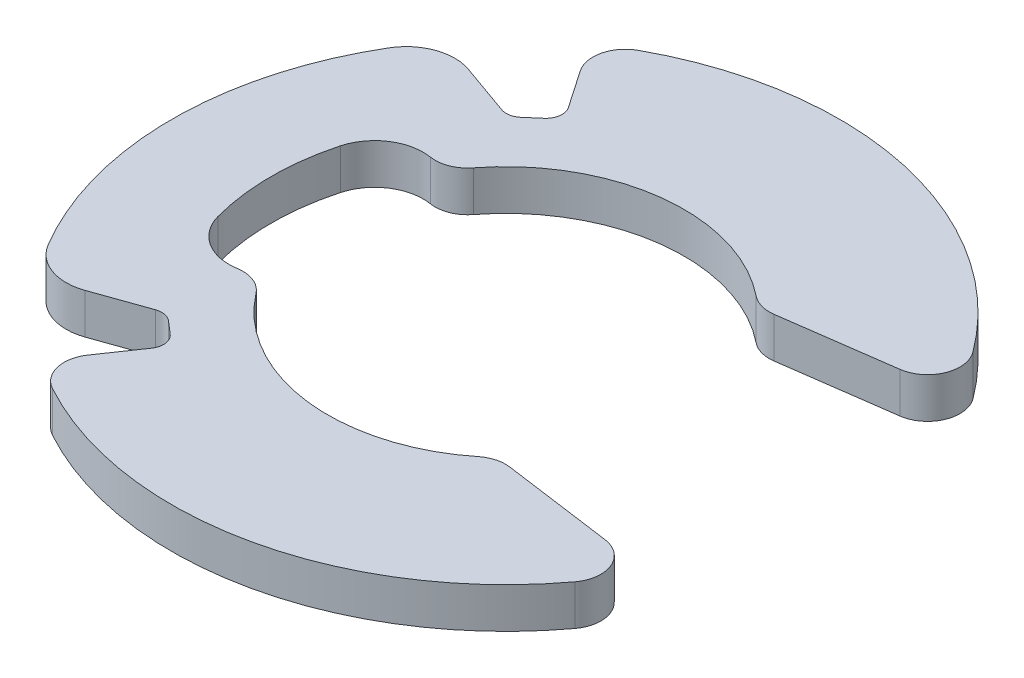
ISO-10303-21;
HEADER;
FILE_DESCRIPTION(('STEP AP214'),'2;1');
FILE_NAME('part.step','',(''),(''),'','','');
FILE_SCHEMA(('AUTOMOTIVE_DESIGN { 1 0 10303 214 1 1 1 1 }'));
ENDSEC;
DATA;
#1=APPLICATION_CONTEXT('core data for automotive mechanical design processes');
#2=APPLICATION_PROTOCOL_DEFINITION('international standard','automotive_design',2000,#1);
#3=PRODUCT_CONTEXT('',#1,'mechanical');
#4=PRODUCT('Part','Part','',(#3));
#5=PRODUCT_RELATED_PRODUCT_CATEGORY('part','',(#4));
#6=PRODUCT_DEFINITION_FORMATION('','',#4);
#7=PRODUCT_DEFINITION_CONTEXT('part definition',#1,'design');
#8=PRODUCT_DEFINITION('design','',#6,#7);
#9=PRODUCT_DEFINITION_SHAPE('','',#8);
#10=(LENGTH_UNIT() NAMED_UNIT(*) SI_UNIT(.MILLI.,.METRE.));
#11=(NAMED_UNIT(*) PLANE_ANGLE_UNIT() SI_UNIT($,.RADIAN.));
#12=(NAMED_UNIT(*) SI_UNIT($,.STERADIAN.) SOLID_ANGLE_UNIT());
#13=UNCERTAINTY_MEASURE_WITH_UNIT(LENGTH_MEASURE(1.E-05),#10,'distance_accuracy_value','');
#14=(GEOMETRIC_REPRESENTATION_CONTEXT(3) GLOBAL_UNCERTAINTY_ASSIGNED_CONTEXT((#13)) GLOBAL_UNIT_ASSIGNED_CONTEXT((#10,
#11,#12)) REPRESENTATION_CONTEXT('',''));
#15=CARTESIAN_POINT('',(0.,0.,0.));
#16=DIRECTION('',(0.,0.,1.));
#17=DIRECTION('',(1.,0.,0.));
#18=AXIS2_PLACEMENT_3D('',#15,#16,#17);
#19=CARTESIAN_POINT('',(1.14274908979972E-13,0.635,0.));
#20=DIRECTION('',(0.,-1.,0.));
#21=DIRECTION('',(0.,0.,-1.));
#22=AXIS2_PLACEMENT_3D('',#19,#20,#21);
#23=CYLINDRICAL_SURFACE('',#22,10.4775);
#24=CARTESIAN_POINT('',(1.14274908979972E-13,-0.635,0.));
#25=DIRECTION('',(0.,1.,0.));
#26=DIRECTION('',(0.,0.,1.));
#27=AXIS2_PLACEMENT_3D('',#24,#25,#26);
#28=CIRCLE('',#27,10.4775);
#29=CARTESIAN_POINT('',(-9.00694258292967,-0.635,-5.35284891976307));
#30=VERTEX_POINT('',#29);
#31=CARTESIAN_POINT('',(-9.00694258292967,-0.635,5.35284891976307));
#32=VERTEX_POINT('',#31);
#33=EDGE_CURVE('E179',#30,#32,#28,.T.);
#34=ORIENTED_EDGE('',*,*,#33,.T.);
#35=DIRECTION('',(0.,-1.,0.));
#36=VECTOR('',#35,1.);
#37=CARTESIAN_POINT('',(-9.00694258292967,0.635,5.35284891976307));
#38=LINE('',#37,#36);
#39=CARTESIAN_POINT('',(-9.00694258292967,0.635,5.35284891976307));
#40=VERTEX_POINT('',#39);
#41=EDGE_CURVE('E302',#40,#32,#38,.T.);
#42=ORIENTED_EDGE('',*,*,#41,.F.);
#43=CARTESIAN_POINT('',(1.14274908979972E-13,0.635,0.));
#44=DIRECTION('',(0.,1.,0.));
#45=DIRECTION('',(0.,0.,1.));
#46=AXIS2_PLACEMENT_3D('',#43,#44,#45);
#47=CIRCLE('',#46,10.4775);
#48=CARTESIAN_POINT('',(-9.00694258292967,0.635,-5.35284891976307));
#49=VERTEX_POINT('',#48);
#50=EDGE_CURVE('E210',#49,#40,#47,.T.);
#51=ORIENTED_EDGE('',*,*,#50,.F.);
#52=DIRECTION('',(0.,-1.,0.));
#53=VECTOR('',#52,1.);
#54=CARTESIAN_POINT('',(-9.00694258292967,0.635,-5.35284891976307));
#55=LINE('',#54,#53);
#56=EDGE_CURVE('E175',#49,#30,#55,.T.);
#57=ORIENTED_EDGE('',*,*,#56,.T.);
#58=EDGE_LOOP('',(#34,#42,#51,#57));
#59=FACE_BOUND('',#58,.T.);
#60=ADVANCED_FACE('F36',(#59),#23,.T.);
#61=CARTESIAN_POINT('',(0.,0.635,0.));
#62=DIRECTION('',(0.,-1.,0.));
#63=DIRECTION('',(0.,0.,-1.));
#64=AXIS2_PLACEMENT_3D('',#61,#62,#63);
#65=CYLINDRICAL_SURFACE('',#64,7.366);
#66=CARTESIAN_POINT('',(0.,-0.635,0.));
#67=DIRECTION('',(0.,-1.,0.));
#68=DIRECTION('',(0.,0.,1.));
#69=AXIS2_PLACEMENT_3D('',#66,#67,#68);
#70=CIRCLE('',#69,7.366);
#71=CARTESIAN_POINT('',(-7.11094530391807,-0.635,1.92156521739066));
#72=VERTEX_POINT('',#71);
#73=CARTESIAN_POINT('',(-7.11094530391807,-0.635,-1.92156521739066));
#74=VERTEX_POINT('',#73);
#75=EDGE_CURVE('E182',#72,#74,#70,.T.);
#76=ORIENTED_EDGE('',*,*,#75,.T.);
#77=DIRECTION('',(0.,-1.,0.));
#78=VECTOR('',#77,1.);
#79=CARTESIAN_POINT('',(-7.11094530391807,0.635,-1.92156521739066));
#80=LINE('',#79,#78);
#81=CARTESIAN_POINT('',(-7.11094530391807,0.635,-1.92156521739066));
#82=VERTEX_POINT('',#81);
#83=EDGE_CURVE('E11',#82,#74,#80,.T.);
#84=ORIENTED_EDGE('',*,*,#83,.F.);
#85=CARTESIAN_POINT('',(0.,0.635,0.));
#86=DIRECTION('',(0.,-1.,0.));
#87=DIRECTION('',(0.,0.,1.));
#88=AXIS2_PLACEMENT_3D('',#85,#86,#87);
#89=CIRCLE('',#88,7.366);
#90=CARTESIAN_POINT('',(-7.11094530391807,0.635,1.92156521739066));
#91=VERTEX_POINT('',#90);
#92=EDGE_CURVE('E117',#91,#82,#89,.T.);
#93=ORIENTED_EDGE('',*,*,#92,.F.);
#94=DIRECTION('',(0.,-1.,0.));
#95=VECTOR('',#94,1.);
#96=CARTESIAN_POINT('',(-7.11094530391807,0.635,1.92156521739066));
#97=LINE('',#96,#95);
#98=EDGE_CURVE('E183',#91,#72,#97,.T.);
#99=ORIENTED_EDGE('',*,*,#98,.T.);
#100=EDGE_LOOP('',(#76,#84,#93,#99));
#101=FACE_BOUND('',#100,.T.);
#102=ADVANCED_FACE('F523',(#101),#65,.F.);
#103=CARTESIAN_POINT('',(-5.63971524103831,0.635,-1.52399999999945));
#104=DIRECTION('',(0.,-1.,0.));
#105=DIRECTION('',(0.,0.,-1.));
#106=AXIS2_PLACEMENT_3D('',#103,#104,#105);
#107=CYLINDRICAL_SURFACE('',#106,1.52400000000016);
#108=CARTESIAN_POINT('',(-5.63971524103831,-0.635,-1.52399999999945));
#109=DIRECTION('',(0.,-1.,0.));
#110=DIRECTION('',(0.,0.,1.));
#111=AXIS2_PLACEMENT_3D('',#108,#109,#110);
#112=CIRCLE('',#111,1.52400000000016);
#113=CARTESIAN_POINT('',(-5.39455199334738,-0.635,-3.02815124970213));
#114=VERTEX_POINT('',#113);
#115=EDGE_CURVE('E185',#74,#114,#112,.T.);
#116=ORIENTED_EDGE('',*,*,#115,.T.);
#117=DIRECTION('',(0.,-1.,0.));
#118=VECTOR('',#117,1.);
#119=CARTESIAN_POINT('',(-5.39455199334738,0.635,-3.02815124970213));
#120=LINE('',#119,#118);
#121=CARTESIAN_POINT('',(-5.39455199334738,0.635,-3.02815124970213));
#122=VERTEX_POINT('',#121);
#123=EDGE_CURVE('E44',#122,#114,#120,.T.);
#124=ORIENTED_EDGE('',*,*,#123,.F.);
#125=CARTESIAN_POINT('',(-5.63971524103831,0.635,-1.52399999999945));
#126=DIRECTION('',(0.,-1.,0.));
#127=DIRECTION('',(0.,0.,1.));
#128=AXIS2_PLACEMENT_3D('',#125,#126,#127);
#129=CIRCLE('',#128,1.52400000000016);
#130=EDGE_CURVE('E520',#82,#122,#129,.T.);
#131=ORIENTED_EDGE('',*,*,#130,.F.);
#132=ORIENTED_EDGE('',*,*,#83,.T.);
#133=EDGE_LOOP('',(#116,#124,#131,#132));
#134=FACE_BOUND('',#133,.T.);
#135=ADVANCED_FACE('F521',(#134),#107,.F.);
#136=CARTESIAN_POINT('',(-5.23110982821991,0.635,-4.03091874950377));
#137=DIRECTION('',(0.,-1.,0.));
#138=DIRECTION('',(0.,0.,-1.));
#139=AXIS2_PLACEMENT_3D('',#136,#137,#138);
#140=CYLINDRICAL_SURFACE('',#139,1.016);
#141=CARTESIAN_POINT('',(-5.23110982821991,-0.635,-4.03091874950377));
#142=DIRECTION('',(0.,1.,0.));
#143=DIRECTION('',(0.,0.,1.));
#144=AXIS2_PLACEMENT_3D('',#141,#142,#143);
#145=CIRCLE('',#144,1.016);
#146=CARTESIAN_POINT('',(-4.4263237008015,-0.635,-3.41077740342622));
#147=VERTEX_POINT('',#146);
#148=EDGE_CURVE('E187',#114,#147,#145,.T.);
#149=ORIENTED_EDGE('',*,*,#148,.T.);
#150=DIRECTION('',(0.,-1.,0.));
#151=VECTOR('',#150,1.);
#152=CARTESIAN_POINT('',(-4.4263237008015,0.635,-3.41077740342622));
#153=LINE('',#152,#151);
#154=CARTESIAN_POINT('',(-4.4263237008015,0.635,-3.41077740342622));
#155=VERTEX_POINT('',#154);
#156=EDGE_CURVE('E238',#155,#147,#153,.T.);
#157=ORIENTED_EDGE('',*,*,#156,.F.);
#158=CARTESIAN_POINT('',(-5.23110982821991,0.635,-4.03091874950377));
#159=DIRECTION('',(0.,1.,0.));
#160=DIRECTION('',(0.,0.,1.));
#161=AXIS2_PLACEMENT_3D('',#158,#159,#160);
#162=CIRCLE('',#161,1.016);
#163=EDGE_CURVE('E247',#122,#155,#162,.T.);
#164=ORIENTED_EDGE('',*,*,#163,.F.);
#165=ORIENTED_EDGE('',*,*,#123,.T.);
#166=EDGE_LOOP('',(#149,#157,#164,#165));
#167=FACE_BOUND('',#166,.T.);
#168=ADVANCED_FACE('F245',(#167),#140,.T.);
#169=CARTESIAN_POINT('',(0.,0.635,0.));
#170=DIRECTION('',(0.,-1.,0.));
#171=DIRECTION('',(0.,0.,-1.));
#172=AXIS2_PLACEMENT_3D('',#169,#170,#171);
#173=CYLINDRICAL_SURFACE('',#172,5.588);
#174=CARTESIAN_POINT('',(0.,-0.635,0.));
#175=DIRECTION('',(0.,-1.,0.));
#176=DIRECTION('',(0.,0.,1.));
#177=AXIS2_PLACEMENT_3D('',#174,#175,#176);
#178=CIRCLE('',#177,5.588);
#179=CARTESIAN_POINT('',(3.49456367614932,-0.635,-4.36047803724978));
#180=VERTEX_POINT('',#179);
#181=EDGE_CURVE('E189',#147,#180,#178,.T.);
#182=ORIENTED_EDGE('',*,*,#181,.T.);
#183=DIRECTION('',(0.,-1.,0.));
#184=VECTOR('',#183,1.);
#185=CARTESIAN_POINT('',(3.49456367614932,0.635,-4.36047803724978));
#186=LINE('',#185,#184);
#187=CARTESIAN_POINT('',(3.49456367614932,0.635,-4.36047803724978));
#188=VERTEX_POINT('',#187);
#189=EDGE_CURVE('E235',#188,#180,#186,.T.);
#190=ORIENTED_EDGE('',*,*,#189,.F.);
#191=CARTESIAN_POINT('',(0.,0.635,0.));
#192=DIRECTION('',(0.,-1.,0.));
#193=DIRECTION('',(0.,0.,1.));
#194=AXIS2_PLACEMENT_3D('',#191,#192,#193);
#195=CIRCLE('',#194,5.588);
#196=EDGE_CURVE('E269',#155,#188,#195,.T.);
#197=ORIENTED_EDGE('',*,*,#196,.F.);
#198=ORIENTED_EDGE('',*,*,#156,.T.);
#199=EDGE_LOOP('',(#182,#190,#197,#198));
#200=FACE_BOUND('',#199,.T.);
#201=ADVANCED_FACE('F260',(#200),#173,.F.);
#202=CARTESIAN_POINT('',(4.12993888999465,0.635,-5.15329222584065));
#203=DIRECTION('',(0.,-1.,0.));
#204=DIRECTION('',(0.,0.,-1.));
#205=AXIS2_PLACEMENT_3D('',#202,#203,#204);
#206=CYLINDRICAL_SURFACE('',#205,1.016);
#207=CARTESIAN_POINT('',(4.12993888999465,-0.635,-5.15329222584065));
#208=DIRECTION('',(0.,1.,0.));
#209=DIRECTION('',(0.,0.,1.));
#210=AXIS2_PLACEMENT_3D('',#207,#208,#209);
#211=CIRCLE('',#210,1.016);
#212=CARTESIAN_POINT('',(4.26923125519139,-0.635,-4.14688592766983));
#213=VERTEX_POINT('',#212);
#214=EDGE_CURVE('E191',#180,#213,#211,.T.);
#215=ORIENTED_EDGE('',*,*,#214,.T.);
#216=DIRECTION('',(0.,-1.,0.));
#217=VECTOR('',#216,1.);
#218=CARTESIAN_POINT('',(4.26923125519139,0.635,-4.14688592766983));
#219=LINE('',#218,#217);
#220=CARTESIAN_POINT('',(4.26923125519139,0.635,-4.14688592766983));
#221=VERTEX_POINT('',#220);
#222=EDGE_CURVE('E232',#221,#213,#219,.T.);
#223=ORIENTED_EDGE('',*,*,#222,.F.);
#224=CARTESIAN_POINT('',(4.12993888999465,0.635,-5.15329222584065));
#225=DIRECTION('',(0.,1.,0.));
#226=DIRECTION('',(0.,0.,1.));
#227=AXIS2_PLACEMENT_3D('',#224,#225,#226);
#228=CIRCLE('',#227,1.016);
#229=EDGE_CURVE('E266',#188,#221,#228,.T.);
#230=ORIENTED_EDGE('',*,*,#229,.F.);
#231=ORIENTED_EDGE('',*,*,#189,.T.);
#232=EDGE_LOOP('',(#215,#223,#230,#231));
#233=FACE_BOUND('',#232,.T.);
#234=ADVANCED_FACE('F264',(#233),#206,.T.);
#235=CARTESIAN_POINT('',(4.26923125519139,0.635,-4.14688592766983));
#236=DIRECTION('',(-0.137098784642455,0.,-0.990557380089393));
#237=DIRECTION('',(-0.990557380089393,0.,0.137098784642455));
#238=AXIS2_PLACEMENT_3D('',#235,#236,#237);
#239=PLANE('',#238);
#240=DIRECTION('',(0.990557380089393,0.,-0.137098784642455));
#241=VECTOR('',#240,1.);
#242=CARTESIAN_POINT('',(4.26923125519139,-0.635,-4.14688592766983));
#243=LINE('',#242,#241);
#244=CARTESIAN_POINT('',(7.74065797441335,-0.635,-4.62735116244273));
#245=VERTEX_POINT('',#244);
#246=EDGE_CURVE('E193',#213,#245,#243,.T.);
#247=ORIENTED_EDGE('',*,*,#246,.T.);
#248=DIRECTION('',(0.,-1.,0.));
#249=VECTOR('',#248,1.);
#250=CARTESIAN_POINT('',(7.74065797441335,0.635,-4.62735116244273));
#251=LINE('',#250,#249);
#252=CARTESIAN_POINT('',(7.74065797441335,0.635,-4.62735116244273));
#253=VERTEX_POINT('',#252);
#254=EDGE_CURVE('E229',#253,#245,#251,.T.);
#255=ORIENTED_EDGE('',*,*,#254,.F.);
#256=DIRECTION('',(0.990557380089393,0.,-0.137098784642455));
#257=VECTOR('',#256,1.);
#258=CARTESIAN_POINT('',(4.26923125519139,0.635,-4.14688592766983));
#259=LINE('',#258,#257);
#260=EDGE_CURVE('E268',#221,#253,#259,.T.);
#261=ORIENTED_EDGE('',*,*,#260,.F.);
#262=ORIENTED_EDGE('',*,*,#222,.T.);
#263=EDGE_LOOP('',(#247,#255,#261,#262));
#264=FACE_BOUND('',#263,.T.);
#265=ADVANCED_FACE('F578',(#264),#239,.F.);
#266=CARTESIAN_POINT('',(7.60136560921662,0.635,-5.63375746061355));
#267=DIRECTION('',(0.,-1.,0.));
#268=DIRECTION('',(0.,0.,-1.));
#269=AXIS2_PLACEMENT_3D('',#266,#267,#268);
#270=CYLINDRICAL_SURFACE('',#269,1.01599999999999);
#271=CARTESIAN_POINT('',(7.60136560921662,-0.635,-5.63375746061355));
#272=DIRECTION('',(0.,1.,0.));
#273=DIRECTION('',(0.,0.,1.));
#274=AXIS2_PLACEMENT_3D('',#271,#272,#273);
#275=CIRCLE('',#274,1.01599999999999);
#276=CARTESIAN_POINT('',(8.41761963436739,-0.635,-6.23872470470629));
#277=VERTEX_POINT('',#276);
#278=EDGE_CURVE('E195',#245,#277,#275,.T.);
#279=ORIENTED_EDGE('',*,*,#278,.T.);
#280=DIRECTION('',(0.,-1.,0.));
#281=VECTOR('',#280,1.);
#282=CARTESIAN_POINT('',(8.41761963436739,0.635,-6.23872470470629));
#283=LINE('',#282,#281);
#284=CARTESIAN_POINT('',(8.41761963436739,0.635,-6.23872470470629));
#285=VERTEX_POINT('',#284);
#286=EDGE_CURVE('E226',#285,#277,#283,.T.);
#287=ORIENTED_EDGE('',*,*,#286,.F.);
#288=CARTESIAN_POINT('',(7.60136560921662,0.635,-5.63375746061355));
#289=DIRECTION('',(0.,1.,0.));
#290=DIRECTION('',(0.,0.,1.));
#291=AXIS2_PLACEMENT_3D('',#288,#289,#290);
#292=CIRCLE('',#291,1.01599999999999);
#293=EDGE_CURVE('E271',#253,#285,#292,.T.);
#294=ORIENTED_EDGE('',*,*,#293,.F.);
#295=ORIENTED_EDGE('',*,*,#254,.T.);
#296=EDGE_LOOP('',(#279,#287,#294,#295));
#297=FACE_BOUND('',#296,.T.);
#298=ADVANCED_FACE('F581',(#297),#270,.T.);
#299=CARTESIAN_POINT('',(0.,0.635,0.));
#300=DIRECTION('',(0.,-1.,0.));
#301=DIRECTION('',(0.,0.,-1.));
#302=AXIS2_PLACEMENT_3D('',#299,#300,#301);
#303=CYLINDRICAL_SURFACE('',#302,10.4775);
#304=CARTESIAN_POINT('',(0.,-0.635,0.));
#305=DIRECTION('',(0.,1.,0.));
#306=DIRECTION('',(0.,0.,1.));
#307=AXIS2_PLACEMENT_3D('',#304,#305,#306);
#308=CIRCLE('',#307,10.4775);
#309=CARTESIAN_POINT('',(-5.03567484923132,-0.635,-9.18803488580768));
#310=VERTEX_POINT('',#309);
#311=EDGE_CURVE('E197',#277,#310,#308,.T.);
#312=ORIENTED_EDGE('',*,*,#311,.T.);
#313=DIRECTION('',(0.,-1.,0.));
#314=VECTOR('',#313,1.);
#315=CARTESIAN_POINT('',(-5.03567484923132,0.635,-9.18803488580768));
#316=LINE('',#315,#314);
#317=CARTESIAN_POINT('',(-5.03567484923132,0.635,-9.18803488580768));
#318=VERTEX_POINT('',#317);
#319=EDGE_CURVE('E223',#318,#310,#316,.T.);
#320=ORIENTED_EDGE('',*,*,#319,.F.);
#321=CARTESIAN_POINT('',(0.,0.635,0.));
#322=DIRECTION('',(0.,1.,0.));
#323=DIRECTION('',(0.,0.,1.));
#324=AXIS2_PLACEMENT_3D('',#321,#322,#323);
#325=CIRCLE('',#324,10.4775);
#326=EDGE_CURVE('E277',#285,#318,#325,.T.);
#327=ORIENTED_EDGE('',*,*,#326,.F.);
#328=ORIENTED_EDGE('',*,*,#286,.T.);
#329=EDGE_LOOP('',(#312,#320,#327,#328));
#330=FACE_BOUND('',#329,.T.);
#331=ADVANCED_FACE('F585',(#330),#303,.T.);
#332=CARTESIAN_POINT('',(-4.54736698506342,0.635,-8.29707392718391));
#333=DIRECTION('',(0.,-1.,0.));
#334=DIRECTION('',(0.,0.,-1.));
#335=AXIS2_PLACEMENT_3D('',#332,#333,#334);
#336=CYLINDRICAL_SURFACE('',#335,1.016);
#337=CARTESIAN_POINT('',(-4.54736698506342,-0.635,-8.29707392718391));
#338=DIRECTION('',(0.,1.,0.));
#339=DIRECTION('',(0.,0.,1.));
#340=AXIS2_PLACEMENT_3D('',#337,#338,#339);
#341=CIRCLE('',#340,1.016);
#342=CARTESIAN_POINT('',(-5.38578246957464,-0.635,-7.7232137740701));
#343=VERTEX_POINT('',#342);
#344=EDGE_CURVE('E199',#310,#343,#341,.T.);
#345=ORIENTED_EDGE('',*,*,#344,.T.);
#346=DIRECTION('',(0.,-1.,0.));
#347=VECTOR('',#346,1.);
#348=CARTESIAN_POINT('',(-5.38578246957464,0.635,-7.7232137740701));
#349=LINE('',#348,#347);
#350=CARTESIAN_POINT('',(-5.38578246957464,0.635,-7.7232137740701));
#351=VERTEX_POINT('',#350);
#352=EDGE_CURVE('E220',#351,#343,#349,.T.);
#353=ORIENTED_EDGE('',*,*,#352,.F.);
#354=CARTESIAN_POINT('',(-4.54736698506342,0.635,-8.29707392718391));
#355=DIRECTION('',(0.,1.,0.));
#356=DIRECTION('',(0.,0.,1.));
#357=AXIS2_PLACEMENT_3D('',#354,#355,#356);
#358=CIRCLE('',#357,1.016);
#359=EDGE_CURVE('E279',#318,#351,#358,.T.);
#360=ORIENTED_EDGE('',*,*,#359,.F.);
#361=ORIENTED_EDGE('',*,*,#319,.T.);
#362=EDGE_LOOP('',(#345,#353,#360,#361));
#363=FACE_BOUND('',#362,.T.);
#364=ADVANCED_FACE('F589',(#363),#336,.T.);
#365=CARTESIAN_POINT('',(-5.38578246957464,0.635,-7.7232137740701));
#366=DIRECTION('',(0.825212091054353,0.,-0.564822985348243));
#367=DIRECTION('',(-0.564822985348243,0.,-0.825212091054353));
#368=AXIS2_PLACEMENT_3D('',#365,#366,#367);
#369=PLANE('',#368);
#370=DIRECTION('',(0.564822985348243,0.,0.825212091054353));
#371=VECTOR('',#370,1.);
#372=CARTESIAN_POINT('',(-5.38578246957464,-0.635,-7.7232137740701));
#373=LINE('',#372,#371);
#374=CARTESIAN_POINT('',(-4.57468029782294,-0.635,-6.53818530219007));
#375=VERTEX_POINT('',#374);
#376=EDGE_CURVE('E201',#343,#375,#373,.T.);
#377=ORIENTED_EDGE('',*,*,#376,.T.);
#378=DIRECTION('',(0.,-1.,0.));
#379=VECTOR('',#378,1.);
#380=CARTESIAN_POINT('',(-4.57468029782294,0.635,-6.53818530219007));
#381=LINE('',#380,#379);
#382=CARTESIAN_POINT('',(-4.57468029782294,0.635,-6.53818530219007));
#383=VERTEX_POINT('',#382);
#384=EDGE_CURVE('E217',#383,#375,#381,.T.);
#385=ORIENTED_EDGE('',*,*,#384,.F.);
#386=DIRECTION('',(0.564822985348243,0.,0.825212091054353));
#387=VECTOR('',#386,1.);
#388=CARTESIAN_POINT('',(-5.38578246957464,0.635,-7.7232137740701));
#389=LINE('',#388,#387);
#390=EDGE_CURVE('E281',#351,#383,#389,.T.);
#391=ORIENTED_EDGE('',*,*,#390,.F.);
#392=ORIENTED_EDGE('',*,*,#352,.T.);
#393=EDGE_LOOP('',(#377,#385,#391,#392));
#394=FACE_BOUND('',#393,.T.);
#395=ADVANCED_FACE('F593',(#394),#369,.F.);
#396=CARTESIAN_POINT('',(-4.99388804007852,0.635,-6.25125522563319));
#397=DIRECTION('',(0.,-1.,0.));
#398=DIRECTION('',(0.,0.,-1.));
#399=AXIS2_PLACEMENT_3D('',#396,#397,#398);
#400=CYLINDRICAL_SURFACE('',#399,0.507999999999915);
#401=CARTESIAN_POINT('',(-4.99388804007852,-0.635,-6.25125522563319));
#402=DIRECTION('',(0.,-1.,0.));
#403=DIRECTION('',(0.,0.,1.));
#404=AXIS2_PLACEMENT_3D('',#401,#402,#403);
#405=CIRCLE('',#404,0.507999999999915);
#406=CARTESIAN_POINT('',(-4.66221892309891,-0.635,-5.86647009488893));
#407=VERTEX_POINT('',#406);
#408=EDGE_CURVE('E203',#375,#407,#405,.T.);
#409=ORIENTED_EDGE('',*,*,#408,.T.);
#410=DIRECTION('',(0.,-1.,0.));
#411=VECTOR('',#410,1.);
#412=CARTESIAN_POINT('',(-4.66221892309891,0.635,-5.86647009488893));
#413=LINE('',#412,#411);
#414=CARTESIAN_POINT('',(-4.66221892309891,0.635,-5.86647009488893));
#415=VERTEX_POINT('',#414);
#416=EDGE_CURVE('E214',#415,#407,#413,.T.);
#417=ORIENTED_EDGE('',*,*,#416,.F.);
#418=CARTESIAN_POINT('',(-4.99388804007852,0.635,-6.25125522563319));
#419=DIRECTION('',(0.,-1.,0.));
#420=DIRECTION('',(0.,0.,1.));
#421=AXIS2_PLACEMENT_3D('',#418,#419,#420);
#422=CIRCLE('',#421,0.507999999999915);
#423=EDGE_CURVE('E283',#383,#415,#422,.T.);
#424=ORIENTED_EDGE('',*,*,#423,.F.);
#425=ORIENTED_EDGE('',*,*,#384,.T.);
#426=EDGE_LOOP('',(#409,#417,#424,#425));
#427=FACE_BOUND('',#426,.T.);
#428=ADVANCED_FACE('F289',(#427),#400,.F.);
#429=CARTESIAN_POINT('',(-4.66221892309894,0.635,-5.86647009488896));
#430=DIRECTION('',(0.652891962558231,0.,0.75745104477244));
#431=DIRECTION('',(0.75745104477244,0.,-0.652891962558231));
#432=AXIS2_PLACEMENT_3D('',#429,#430,#431);
#433=PLANE('',#432);
#434=DIRECTION('',(-0.75745104477244,0.,0.652891962558231));
#435=VECTOR('',#434,1.);
#436=CARTESIAN_POINT('',(-4.66221892309894,-0.635,-5.86647009488896));
#437=LINE('',#436,#435);
#438=CARTESIAN_POINT('',(-5.05650674369664,-0.635,-5.52661004613798));
#439=VERTEX_POINT('',#438);
#440=EDGE_CURVE('E205',#407,#439,#437,.T.);
#441=ORIENTED_EDGE('',*,*,#440,.T.);
#442=DIRECTION('',(0.,-1.,0.));
#443=VECTOR('',#442,1.);
#444=CARTESIAN_POINT('',(-5.05650674369664,0.635,-5.52661004613798));
#445=LINE('',#444,#443);
#446=CARTESIAN_POINT('',(-5.05650674369664,0.635,-5.52661004613798));
#447=VERTEX_POINT('',#446);
#448=EDGE_CURVE('E170',#447,#439,#445,.T.);
#449=ORIENTED_EDGE('',*,*,#448,.F.);
#450=DIRECTION('',(-0.75745104477244,0.,0.652891962558231));
#451=VECTOR('',#450,1.);
#452=CARTESIAN_POINT('',(-4.66221892309894,0.635,-5.86647009488896));
#453=LINE('',#452,#451);
#454=EDGE_CURVE('E161',#415,#447,#453,.T.);
#455=ORIENTED_EDGE('',*,*,#454,.F.);
#456=ORIENTED_EDGE('',*,*,#416,.T.);
#457=EDGE_LOOP('',(#441,#449,#455,#456));
#458=FACE_BOUND('',#457,.T.);
#459=ADVANCED_FACE('F293',(#458),#433,.F.);
#460=CARTESIAN_POINT('',(-5.38817586067612,0.635,-5.91139517688227));
#461=DIRECTION('',(0.,-1.,0.));
#462=DIRECTION('',(0.,0.,-1.));
#463=AXIS2_PLACEMENT_3D('',#460,#461,#462);
#464=CYLINDRICAL_SURFACE('',#463,0.507999999999914);
#465=CARTESIAN_POINT('',(-5.38817586067612,-0.635,-5.91139517688227));
#466=DIRECTION('',(0.,-1.,0.));
#467=DIRECTION('',(0.,0.,1.));
#468=AXIS2_PLACEMENT_3D('',#465,#466,#467);
#469=CIRCLE('',#468,0.507999999999914);
#470=CARTESIAN_POINT('',(-5.5580004534037,-0.635,-5.43262215372325));
#471=VERTEX_POINT('',#470);
#472=EDGE_CURVE('E169',#439,#471,#469,.T.);
#473=ORIENTED_EDGE('',*,*,#472,.T.);
#474=DIRECTION('',(0.,-1.,0.));
#475=VECTOR('',#474,1.);
#476=CARTESIAN_POINT('',(-5.5580004534037,0.635,-5.43262215372325));
#477=LINE('',#476,#475);
#478=CARTESIAN_POINT('',(-5.5580004534037,0.635,-5.43262215372325));
#479=VERTEX_POINT('',#478);
#480=EDGE_CURVE('E166',#479,#471,#477,.T.);
#481=ORIENTED_EDGE('',*,*,#480,.F.);
#482=CARTESIAN_POINT('',(-5.38817586067612,0.635,-5.91139517688227));
#483=DIRECTION('',(0.,-1.,0.));
#484=DIRECTION('',(0.,0.,1.));
#485=AXIS2_PLACEMENT_3D('',#482,#483,#484);
#486=CIRCLE('',#485,0.507999999999914);
#487=EDGE_CURVE('E155',#447,#479,#486,.T.);
#488=ORIENTED_EDGE('',*,*,#487,.F.);
#489=ORIENTED_EDGE('',*,*,#448,.T.);
#490=EDGE_LOOP('',(#473,#481,#488,#489));
#491=FACE_BOUND('',#490,.T.);
#492=ADVANCED_FACE('F167',(#491),#464,.F.);
#493=CARTESIAN_POINT('',(-5.55800045340372,0.635,-5.4326221537232));
#494=DIRECTION('',(-0.334300379385367,0.,0.942466581021735));
#495=DIRECTION('',(0.942466581021736,0.,0.334300379385367));
#496=AXIS2_PLACEMENT_3D('',#493,#494,#495);
#497=PLANE('',#496);
#498=DIRECTION('',(-0.942466581021736,0.,-0.334300379385367));
#499=VECTOR('',#498,1.);
#500=CARTESIAN_POINT('',(-5.55800045340372,-0.635,-5.4326221537232));
#501=LINE('',#500,#499);
#502=CARTESIAN_POINT('',(-7.18736806541079,-0.635,-6.01057178272934));
#503=VERTEX_POINT('',#502);
#504=EDGE_CURVE('E103',#471,#503,#501,.T.);
#505=ORIENTED_EDGE('',*,*,#504,.T.);
#506=DIRECTION('',(0.,-1.,0.));
#507=VECTOR('',#506,1.);
#508=CARTESIAN_POINT('',(-7.18736806541079,0.635,-6.01057178272934));
#509=LINE('',#508,#507);
#510=CARTESIAN_POINT('',(-7.18736806541079,0.635,-6.01057178272934));
#511=VERTEX_POINT('',#510);
#512=EDGE_CURVE('E171',#511,#503,#509,.T.);
#513=ORIENTED_EDGE('',*,*,#512,.F.);
#514=DIRECTION('',(-0.942466581021736,0.,-0.334300379385367));
#515=VECTOR('',#514,1.);
#516=CARTESIAN_POINT('',(-5.55800045340372,0.635,-5.4326221537232));
#517=LINE('',#516,#515);
#518=EDGE_CURVE('E159',#479,#511,#517,.T.);
#519=ORIENTED_EDGE('',*,*,#518,.F.);
#520=ORIENTED_EDGE('',*,*,#480,.T.);
#521=EDGE_LOOP('',(#505,#513,#519,#520));
#522=FACE_BOUND('',#521,.T.);
#523=ADVANCED_FACE('F173',(#522),#497,.F.);
#524=CARTESIAN_POINT('',(-7.69684184359433,0.635,-4.57425271325206));
#525=DIRECTION('',(0.,-1.,0.));
#526=DIRECTION('',(0.,0.,-1.));
#527=AXIS2_PLACEMENT_3D('',#524,#525,#526);
#528=CYLINDRICAL_SURFACE('',#527,1.52400000000011);
#529=CARTESIAN_POINT('',(-7.69684184359433,-0.635,-4.57425271325206));
#530=DIRECTION('',(0.,1.,0.));
#531=DIRECTION('',(0.,0.,1.));
#532=AXIS2_PLACEMENT_3D('',#529,#530,#531);
#533=CIRCLE('',#532,1.52400000000011);
#534=EDGE_CURVE('E109',#503,#30,#533,.T.);
#535=ORIENTED_EDGE('',*,*,#534,.T.);
#536=ORIENTED_EDGE('',*,*,#56,.F.);
#537=CARTESIAN_POINT('',(-7.69684184359433,0.635,-4.57425271325206));
#538=DIRECTION('',(0.,1.,0.));
#539=DIRECTION('',(0.,0.,1.));
#540=AXIS2_PLACEMENT_3D('',#537,#538,#539);
#541=CIRCLE('',#540,1.52400000000011);
#542=EDGE_CURVE('E52',#511,#49,#541,.T.);
#543=ORIENTED_EDGE('',*,*,#542,.F.);
#544=ORIENTED_EDGE('',*,*,#512,.T.);
#545=EDGE_LOOP('',(#535,#536,#543,#544));
#546=FACE_BOUND('',#545,.T.);
#547=ADVANCED_FACE('F606',(#546),#528,.T.);
#548=CARTESIAN_POINT('',(1.14274908979972E-13,0.635,0.));
#549=DIRECTION('',(0.,1.,0.));
#550=DIRECTION('',(0.,0.,1.));
#551=AXIS2_PLACEMENT_3D('',#548,#549,#550);
#552=PLANE('',#551);
#553=ORIENTED_EDGE('',*,*,#50,.T.);
#554=CARTESIAN_POINT('',(-7.69684184359433,0.635,4.57425271325206));
#555=DIRECTION('',(0.,-1.,0.));
#556=DIRECTION('',(0.,0.,-1.));
#557=AXIS2_PLACEMENT_3D('',#554,#555,#556);
#558=CIRCLE('',#557,1.52400000000011);
#559=CARTESIAN_POINT('',(-7.18736806541079,0.635,6.01057178272934));
#560=VERTEX_POINT('',#559);
#561=EDGE_CURVE('E446',#560,#40,#558,.T.);
#562=ORIENTED_EDGE('',*,*,#561,.F.);
#563=DIRECTION('',(-0.942466581021736,0.,0.334300379385367));
#564=VECTOR('',#563,1.);
#565=CARTESIAN_POINT('',(-5.55800045340372,0.635,5.4326221537232));
#566=LINE('',#565,#564);
#567=CARTESIAN_POINT('',(-5.5580004534037,0.635,5.43262215372325));
#568=VERTEX_POINT('',#567);
#569=EDGE_CURVE('E443',#568,#560,#566,.T.);
#570=ORIENTED_EDGE('',*,*,#569,.F.);
#571=CARTESIAN_POINT('',(-5.38817586067612,0.635,5.91139517688227));
#572=DIRECTION('',(0.,1.,0.));
#573=DIRECTION('',(0.,0.,-1.));
#574=AXIS2_PLACEMENT_3D('',#571,#572,#573);
#575=CIRCLE('',#574,0.507999999999914);
#576=CARTESIAN_POINT('',(-5.05650674369664,0.635,5.52661004613798));
#577=VERTEX_POINT('',#576);
#578=EDGE_CURVE('E440',#577,#568,#575,.T.);
#579=ORIENTED_EDGE('',*,*,#578,.F.);
#580=DIRECTION('',(-0.75745104477244,0.,-0.652891962558231));
#581=VECTOR('',#580,1.);
#582=CARTESIAN_POINT('',(-4.66221892309894,0.635,5.86647009488896));
#583=LINE('',#582,#581);
#584=CARTESIAN_POINT('',(-4.66221892309891,0.635,5.86647009488893));
#585=VERTEX_POINT('',#584);
#586=EDGE_CURVE('E437',#585,#577,#583,.T.);
#587=ORIENTED_EDGE('',*,*,#586,.F.);
#588=CARTESIAN_POINT('',(-4.99388804007852,0.635,6.25125522563319));
#589=DIRECTION('',(0.,1.,0.));
#590=DIRECTION('',(0.,0.,-1.));
#591=AXIS2_PLACEMENT_3D('',#588,#589,#590);
#592=CIRCLE('',#591,0.507999999999915);
#593=CARTESIAN_POINT('',(-4.57468029782294,0.635,6.53818530219007));
#594=VERTEX_POINT('',#593);
#595=EDGE_CURVE('E434',#594,#585,#592,.T.);
#596=ORIENTED_EDGE('',*,*,#595,.F.);
#597=DIRECTION('',(0.564822985348243,0.,-0.825212091054353));
#598=VECTOR('',#597,1.);
#599=CARTESIAN_POINT('',(-5.38578246957464,0.635,7.7232137740701));
#600=LINE('',#599,#598);
#601=CARTESIAN_POINT('',(-5.38578246957464,0.635,7.7232137740701));
#602=VERTEX_POINT('',#601);
#603=EDGE_CURVE('E431',#602,#594,#600,.T.);
#604=ORIENTED_EDGE('',*,*,#603,.F.);
#605=CARTESIAN_POINT('',(-4.54736698506342,0.635,8.29707392718391));
#606=DIRECTION('',(0.,-1.,0.));
#607=DIRECTION('',(0.,0.,-1.));
#608=AXIS2_PLACEMENT_3D('',#605,#606,#607);
#609=CIRCLE('',#608,1.016);
#610=CARTESIAN_POINT('',(-5.03567484923132,0.635,9.18803488580768));
#611=VERTEX_POINT('',#610);
#612=EDGE_CURVE('E428',#611,#602,#609,.T.);
#613=ORIENTED_EDGE('',*,*,#612,.F.);
#614=CARTESIAN_POINT('',(0.,0.635,0.));
#615=DIRECTION('',(0.,-1.,0.));
#616=DIRECTION('',(0.,0.,-1.));
#617=AXIS2_PLACEMENT_3D('',#614,#615,#616);
#618=CIRCLE('',#617,10.4775);
#619=CARTESIAN_POINT('',(8.41761963436739,0.635,6.23872470470629));
#620=VERTEX_POINT('',#619);
#621=EDGE_CURVE('E425',#620,#611,#618,.T.);
#622=ORIENTED_EDGE('',*,*,#621,.F.);
#623=CARTESIAN_POINT('',(7.60136560921662,0.635,5.63375746061355));
#624=DIRECTION('',(0.,-1.,0.));
#625=DIRECTION('',(0.,0.,-1.));
#626=AXIS2_PLACEMENT_3D('',#623,#624,#625);
#627=CIRCLE('',#626,1.01599999999999);
#628=CARTESIAN_POINT('',(7.74065797441335,0.635,4.62735116244273));
#629=VERTEX_POINT('',#628);
#630=EDGE_CURVE('E422',#629,#620,#627,.T.);
#631=ORIENTED_EDGE('',*,*,#630,.F.);
#632=DIRECTION('',(0.990557380089393,0.,0.137098784642455));
#633=VECTOR('',#632,1.);
#634=CARTESIAN_POINT('',(4.26923125519139,0.635,4.14688592766983));
#635=LINE('',#634,#633);
#636=CARTESIAN_POINT('',(4.26923125519139,0.635,4.14688592766983));
#637=VERTEX_POINT('',#636);
#638=EDGE_CURVE('E419',#637,#629,#635,.T.);
#639=ORIENTED_EDGE('',*,*,#638,.F.);
#640=CARTESIAN_POINT('',(4.12993888999465,0.635,5.15329222584065));
#641=DIRECTION('',(0.,-1.,0.));
#642=DIRECTION('',(0.,0.,-1.));
#643=AXIS2_PLACEMENT_3D('',#640,#641,#642);
#644=CIRCLE('',#643,1.016);
#645=CARTESIAN_POINT('',(3.49456367614932,0.635,4.36047803724978));
#646=VERTEX_POINT('',#645);
#647=EDGE_CURVE('E416',#646,#637,#644,.T.);
#648=ORIENTED_EDGE('',*,*,#647,.F.);
#649=CARTESIAN_POINT('',(0.,0.635,0.));
#650=DIRECTION('',(0.,1.,0.));
#651=DIRECTION('',(0.,0.,-1.));
#652=AXIS2_PLACEMENT_3D('',#649,#650,#651);
#653=CIRCLE('',#652,5.588);
#654=CARTESIAN_POINT('',(-4.4263237008015,0.635,3.41077740342622));
#655=VERTEX_POINT('',#654);
#656=EDGE_CURVE('E394',#655,#646,#653,.T.);
#657=ORIENTED_EDGE('',*,*,#656,.F.);
#658=CARTESIAN_POINT('',(-5.23110982821991,0.635,4.03091874950377));
#659=DIRECTION('',(0.,-1.,0.));
#660=DIRECTION('',(0.,0.,-1.));
#661=AXIS2_PLACEMENT_3D('',#658,#659,#660);
#662=CIRCLE('',#661,1.016);
#663=CARTESIAN_POINT('',(-5.39455199334738,0.635,3.02815124970213));
#664=VERTEX_POINT('',#663);
#665=EDGE_CURVE('E388',#664,#655,#662,.T.);
#666=ORIENTED_EDGE('',*,*,#665,.F.);
#667=CARTESIAN_POINT('',(-5.63971524103831,0.635,1.52399999999945));
#668=DIRECTION('',(0.,1.,0.));
#669=DIRECTION('',(0.,0.,-1.));
#670=AXIS2_PLACEMENT_3D('',#667,#668,#669);
#671=CIRCLE('',#670,1.52400000000016);
#672=EDGE_CURVE('E391',#91,#664,#671,.T.);
#673=ORIENTED_EDGE('',*,*,#672,.F.);
#674=ORIENTED_EDGE('',*,*,#92,.T.);
#675=ORIENTED_EDGE('',*,*,#130,.T.);
#676=ORIENTED_EDGE('',*,*,#163,.T.);
#677=ORIENTED_EDGE('',*,*,#196,.T.);
#678=ORIENTED_EDGE('',*,*,#229,.T.);
#679=ORIENTED_EDGE('',*,*,#260,.T.);
#680=ORIENTED_EDGE('',*,*,#293,.T.);
#681=ORIENTED_EDGE('',*,*,#326,.T.);
#682=ORIENTED_EDGE('',*,*,#359,.T.);
#683=ORIENTED_EDGE('',*,*,#390,.T.);
#684=ORIENTED_EDGE('',*,*,#423,.T.);
#685=ORIENTED_EDGE('',*,*,#454,.T.);
#686=ORIENTED_EDGE('',*,*,#487,.T.);
#687=ORIENTED_EDGE('',*,*,#518,.T.);
#688=ORIENTED_EDGE('',*,*,#542,.T.);
#689=EDGE_LOOP('',(#553,#562,#570,#579,#587,#596,#604,#613,#622,#631,#639,#648,#657,#666,#673,
#674,#675,#676,#677,#678,#679,#680,#681,#682,#683,#684,#685,#686,#687,#688));
#690=FACE_BOUND('',#689,.T.);
#691=ADVANCED_FACE('F157',(#690),#552,.T.);
#692=CARTESIAN_POINT('',(1.14274908979972E-13,-0.635,0.));
#693=DIRECTION('',(0.,1.,0.));
#694=DIRECTION('',(0.,0.,1.));
#695=AXIS2_PLACEMENT_3D('',#692,#693,#694);
#696=PLANE('',#695);
#697=ORIENTED_EDGE('',*,*,#33,.F.);
#698=ORIENTED_EDGE('',*,*,#534,.F.);
#699=ORIENTED_EDGE('',*,*,#504,.F.);
#700=ORIENTED_EDGE('',*,*,#472,.F.);
#701=ORIENTED_EDGE('',*,*,#440,.F.);
#702=ORIENTED_EDGE('',*,*,#408,.F.);
#703=ORIENTED_EDGE('',*,*,#376,.F.);
#704=ORIENTED_EDGE('',*,*,#344,.F.);
#705=ORIENTED_EDGE('',*,*,#311,.F.);
#706=ORIENTED_EDGE('',*,*,#278,.F.);
#707=ORIENTED_EDGE('',*,*,#246,.F.);
#708=ORIENTED_EDGE('',*,*,#214,.F.);
#709=ORIENTED_EDGE('',*,*,#181,.F.);
#710=ORIENTED_EDGE('',*,*,#148,.F.);
#711=ORIENTED_EDGE('',*,*,#115,.F.);
#712=ORIENTED_EDGE('',*,*,#75,.F.);
#713=CARTESIAN_POINT('',(-5.63971524103831,-0.635,1.52399999999945));
#714=DIRECTION('',(0.,1.,0.));
#715=DIRECTION('',(0.,0.,-1.));
#716=AXIS2_PLACEMENT_3D('',#713,#714,#715);
#717=CIRCLE('',#716,1.52400000000016);
#718=CARTESIAN_POINT('',(-5.39455199334738,-0.635,3.02815124970213));
#719=VERTEX_POINT('',#718);
#720=EDGE_CURVE('E449',#72,#719,#717,.T.);
#721=ORIENTED_EDGE('',*,*,#720,.T.);
#722=CARTESIAN_POINT('',(-5.23110982821991,-0.635,4.03091874950377));
#723=DIRECTION('',(0.,-1.,0.));
#724=DIRECTION('',(0.,0.,-1.));
#725=AXIS2_PLACEMENT_3D('',#722,#723,#724);
#726=CIRCLE('',#725,1.016);
#727=CARTESIAN_POINT('',(-4.4263237008015,-0.635,3.41077740342622));
#728=VERTEX_POINT('',#727);
#729=EDGE_CURVE('E403',#719,#728,#726,.T.);
#730=ORIENTED_EDGE('',*,*,#729,.T.);
#731=CARTESIAN_POINT('',(0.,-0.635,0.));
#732=DIRECTION('',(0.,1.,0.));
#733=DIRECTION('',(0.,0.,-1.));
#734=AXIS2_PLACEMENT_3D('',#731,#732,#733);
#735=CIRCLE('',#734,5.588);
#736=CARTESIAN_POINT('',(3.49456367614932,-0.635,4.36047803724978));
#737=VERTEX_POINT('',#736);
#738=EDGE_CURVE('E452',#728,#737,#735,.T.);
#739=ORIENTED_EDGE('',*,*,#738,.T.);
#740=CARTESIAN_POINT('',(4.12993888999465,-0.635,5.15329222584065));
#741=DIRECTION('',(0.,-1.,0.));
#742=DIRECTION('',(0.,0.,-1.));
#743=AXIS2_PLACEMENT_3D('',#740,#741,#742);
#744=CIRCLE('',#743,1.016);
#745=CARTESIAN_POINT('',(4.26923125519139,-0.635,4.14688592766983));
#746=VERTEX_POINT('',#745);
#747=EDGE_CURVE('E455',#737,#746,#744,.T.);
#748=ORIENTED_EDGE('',*,*,#747,.T.);
#749=DIRECTION('',(0.990557380089393,0.,0.137098784642455));
#750=VECTOR('',#749,1.);
#751=CARTESIAN_POINT('',(4.26923125519139,-0.635,4.14688592766983));
#752=LINE('',#751,#750);
#753=CARTESIAN_POINT('',(7.74065797441335,-0.635,4.62735116244273));
#754=VERTEX_POINT('',#753);
#755=EDGE_CURVE('E458',#746,#754,#752,.T.);
#756=ORIENTED_EDGE('',*,*,#755,.T.);
#757=CARTESIAN_POINT('',(7.60136560921662,-0.635,5.63375746061355));
#758=DIRECTION('',(0.,-1.,0.));
#759=DIRECTION('',(0.,0.,-1.));
#760=AXIS2_PLACEMENT_3D('',#757,#758,#759);
#761=CIRCLE('',#760,1.01599999999999);
#762=CARTESIAN_POINT('',(8.41761963436739,-0.635,6.23872470470629));
#763=VERTEX_POINT('',#762);
#764=EDGE_CURVE('E461',#754,#763,#761,.T.);
#765=ORIENTED_EDGE('',*,*,#764,.T.);
#766=CARTESIAN_POINT('',(0.,-0.635,0.));
#767=DIRECTION('',(0.,-1.,0.));
#768=DIRECTION('',(0.,0.,-1.));
#769=AXIS2_PLACEMENT_3D('',#766,#767,#768);
#770=CIRCLE('',#769,10.4775);
#771=CARTESIAN_POINT('',(-5.03567484923132,-0.635,9.18803488580768));
#772=VERTEX_POINT('',#771);
#773=EDGE_CURVE('E464',#763,#772,#770,.T.);
#774=ORIENTED_EDGE('',*,*,#773,.T.);
#775=CARTESIAN_POINT('',(-4.54736698506342,-0.635,8.29707392718391));
#776=DIRECTION('',(0.,-1.,0.));
#777=DIRECTION('',(0.,0.,-1.));
#778=AXIS2_PLACEMENT_3D('',#775,#776,#777);
#779=CIRCLE('',#778,1.016);
#780=CARTESIAN_POINT('',(-5.38578246957464,-0.635,7.7232137740701));
#781=VERTEX_POINT('',#780);
#782=EDGE_CURVE('E467',#772,#781,#779,.T.);
#783=ORIENTED_EDGE('',*,*,#782,.T.);
#784=DIRECTION('',(0.564822985348243,0.,-0.825212091054353));
#785=VECTOR('',#784,1.);
#786=CARTESIAN_POINT('',(-5.38578246957464,-0.635,7.7232137740701));
#787=LINE('',#786,#785);
#788=CARTESIAN_POINT('',(-4.57468029782294,-0.635,6.53818530219007));
#789=VERTEX_POINT('',#788);
#790=EDGE_CURVE('E470',#781,#789,#787,.T.);
#791=ORIENTED_EDGE('',*,*,#790,.T.);
#792=CARTESIAN_POINT('',(-4.99388804007852,-0.635,6.25125522563319));
#793=DIRECTION('',(0.,1.,0.));
#794=DIRECTION('',(0.,0.,-1.));
#795=AXIS2_PLACEMENT_3D('',#792,#793,#794);
#796=CIRCLE('',#795,0.507999999999915);
#797=CARTESIAN_POINT('',(-4.66221892309891,-0.635,5.86647009488893));
#798=VERTEX_POINT('',#797);
#799=EDGE_CURVE('E473',#789,#798,#796,.T.);
#800=ORIENTED_EDGE('',*,*,#799,.T.);
#801=DIRECTION('',(-0.75745104477244,0.,-0.652891962558231));
#802=VECTOR('',#801,1.);
#803=CARTESIAN_POINT('',(-4.66221892309894,-0.635,5.86647009488896));
#804=LINE('',#803,#802);
#805=CARTESIAN_POINT('',(-5.05650674369664,-0.635,5.52661004613798));
#806=VERTEX_POINT('',#805);
#807=EDGE_CURVE('E476',#798,#806,#804,.T.);
#808=ORIENTED_EDGE('',*,*,#807,.T.);
#809=CARTESIAN_POINT('',(-5.38817586067612,-0.635,5.91139517688227));
#810=DIRECTION('',(0.,1.,0.));
#811=DIRECTION('',(0.,0.,-1.));
#812=AXIS2_PLACEMENT_3D('',#809,#810,#811);
#813=CIRCLE('',#812,0.507999999999914);
#814=CARTESIAN_POINT('',(-5.5580004534037,-0.635,5.43262215372325));
#815=VERTEX_POINT('',#814);
#816=EDGE_CURVE('E479',#806,#815,#813,.T.);
#817=ORIENTED_EDGE('',*,*,#816,.T.);
#818=DIRECTION('',(-0.942466581021736,0.,0.334300379385367));
#819=VECTOR('',#818,1.);
#820=CARTESIAN_POINT('',(-5.55800045340372,-0.635,5.4326221537232));
#821=LINE('',#820,#819);
#822=CARTESIAN_POINT('',(-7.18736806541079,-0.635,6.01057178272934));
#823=VERTEX_POINT('',#822);
#824=EDGE_CURVE('E412',#815,#823,#821,.T.);
#825=ORIENTED_EDGE('',*,*,#824,.T.);
#826=CARTESIAN_POINT('',(-7.69684184359433,-0.635,4.57425271325206));
#827=DIRECTION('',(0.,-1.,0.));
#828=DIRECTION('',(0.,0.,-1.));
#829=AXIS2_PLACEMENT_3D('',#826,#827,#828);
#830=CIRCLE('',#829,1.52400000000011);
#831=EDGE_CURVE('E297',#823,#32,#830,.T.);
#832=ORIENTED_EDGE('',*,*,#831,.T.);
#833=EDGE_LOOP('',(#697,#698,#699,#700,#701,#702,#703,#704,#705,#706,#707,#708,#709,#710,#711,
#712,#721,#730,#739,#748,#756,#765,#774,#783,#791,#800,#808,#817,#825,#832));
#834=FACE_BOUND('',#833,.T.);
#835=ADVANCED_FACE('F254',(#834),#696,.F.);
#836=CARTESIAN_POINT('',(-5.63971524103831,0.635,1.52399999999945));
#837=DIRECTION('',(0.,-1.,0.));
#838=DIRECTION('',(0.,0.,1.));
#839=AXIS2_PLACEMENT_3D('',#836,#837,#838);
#840=CYLINDRICAL_SURFACE('',#839,1.52400000000016);
#841=ORIENTED_EDGE('',*,*,#720,.F.);
#842=ORIENTED_EDGE('',*,*,#98,.F.);
#843=ORIENTED_EDGE('',*,*,#672,.T.);
#844=DIRECTION('',(0.,-1.,0.));
#845=VECTOR('',#844,1.);
#846=CARTESIAN_POINT('',(-5.39455199334738,0.635,3.02815124970213));
#847=LINE('',#846,#845);
#848=EDGE_CURVE('E400',#664,#719,#847,.T.);
#849=ORIENTED_EDGE('',*,*,#848,.T.);
#850=EDGE_LOOP('',(#841,#842,#843,#849));
#851=FACE_BOUND('',#850,.T.);
#852=ADVANCED_FACE('F409',(#851),#840,.F.);
#853=CARTESIAN_POINT('',(-5.23110982821991,0.635,4.03091874950377));
#854=DIRECTION('',(0.,-1.,0.));
#855=DIRECTION('',(0.,0.,1.));
#856=AXIS2_PLACEMENT_3D('',#853,#854,#855);
#857=CYLINDRICAL_SURFACE('',#856,1.016);
#858=ORIENTED_EDGE('',*,*,#729,.F.);
#859=ORIENTED_EDGE('',*,*,#848,.F.);
#860=ORIENTED_EDGE('',*,*,#665,.T.);
#861=DIRECTION('',(0.,-1.,0.));
#862=VECTOR('',#861,1.);
#863=CARTESIAN_POINT('',(-4.4263237008015,0.635,3.41077740342622));
#864=LINE('',#863,#862);
#865=EDGE_CURVE('E407',#655,#728,#864,.T.);
#866=ORIENTED_EDGE('',*,*,#865,.T.);
#867=EDGE_LOOP('',(#858,#859,#860,#866));
#868=FACE_BOUND('',#867,.T.);
#869=ADVANCED_FACE('F401',(#868),#857,.T.);
#870=CARTESIAN_POINT('',(0.,0.635,0.));
#871=DIRECTION('',(0.,-1.,0.));
#872=DIRECTION('',(0.,0.,1.));
#873=AXIS2_PLACEMENT_3D('',#870,#871,#872);
#874=CYLINDRICAL_SURFACE('',#873,5.588);
#875=ORIENTED_EDGE('',*,*,#738,.F.);
#876=ORIENTED_EDGE('',*,*,#865,.F.);
#877=ORIENTED_EDGE('',*,*,#656,.T.);
#878=DIRECTION('',(0.,-1.,0.));
#879=VECTOR('',#878,1.);
#880=CARTESIAN_POINT('',(3.49456367614932,0.635,4.36047803724978));
#881=LINE('',#880,#879);
#882=EDGE_CURVE('E513',#646,#737,#881,.T.);
#883=ORIENTED_EDGE('',*,*,#882,.T.);
#884=EDGE_LOOP('',(#875,#876,#877,#883));
#885=FACE_BOUND('',#884,.T.);
#886=ADVANCED_FACE('F525',(#885),#874,.F.);
#887=CARTESIAN_POINT('',(4.12993888999465,0.635,5.15329222584065));
#888=DIRECTION('',(0.,-1.,0.));
#889=DIRECTION('',(0.,0.,1.));
#890=AXIS2_PLACEMENT_3D('',#887,#888,#889);
#891=CYLINDRICAL_SURFACE('',#890,1.016);
#892=ORIENTED_EDGE('',*,*,#747,.F.);
#893=ORIENTED_EDGE('',*,*,#882,.F.);
#894=ORIENTED_EDGE('',*,*,#647,.T.);
#895=DIRECTION('',(0.,-1.,0.));
#896=VECTOR('',#895,1.);
#897=CARTESIAN_POINT('',(4.26923125519139,0.635,4.14688592766983));
#898=LINE('',#897,#896);
#899=EDGE_CURVE('E510',#637,#746,#898,.T.);
#900=ORIENTED_EDGE('',*,*,#899,.T.);
#901=EDGE_LOOP('',(#892,#893,#894,#900));
#902=FACE_BOUND('',#901,.T.);
#903=ADVANCED_FACE('F528',(#902),#891,.T.);
#904=CARTESIAN_POINT('',(4.26923125519139,0.635,4.14688592766983));
#905=DIRECTION('',(-0.137098784642455,0.,0.990557380089393));
#906=DIRECTION('',(-0.990557380089393,0.,-0.137098784642455));
#907=AXIS2_PLACEMENT_3D('',#904,#905,#906);
#908=PLANE('',#907);
#909=ORIENTED_EDGE('',*,*,#755,.F.);
#910=ORIENTED_EDGE('',*,*,#899,.F.);
#911=ORIENTED_EDGE('',*,*,#638,.T.);
#912=DIRECTION('',(0.,-1.,0.));
#913=VECTOR('',#912,1.);
#914=CARTESIAN_POINT('',(7.74065797441335,0.635,4.62735116244273));
#915=LINE('',#914,#913);
#916=EDGE_CURVE('E507',#629,#754,#915,.T.);
#917=ORIENTED_EDGE('',*,*,#916,.T.);
#918=EDGE_LOOP('',(#909,#910,#911,#917));
#919=FACE_BOUND('',#918,.T.);
#920=ADVANCED_FACE('F531',(#919),#908,.F.);
#921=CARTESIAN_POINT('',(7.60136560921662,0.635,5.63375746061355));
#922=DIRECTION('',(0.,-1.,0.));
#923=DIRECTION('',(0.,0.,1.));
#924=AXIS2_PLACEMENT_3D('',#921,#922,#923);
#925=CYLINDRICAL_SURFACE('',#924,1.01599999999999);
#926=ORIENTED_EDGE('',*,*,#764,.F.);
#927=ORIENTED_EDGE('',*,*,#916,.F.);
#928=ORIENTED_EDGE('',*,*,#630,.T.);
#929=DIRECTION('',(0.,-1.,0.));
#930=VECTOR('',#929,1.);
#931=CARTESIAN_POINT('',(8.41761963436739,0.635,6.23872470470629));
#932=LINE('',#931,#930);
#933=EDGE_CURVE('E504',#620,#763,#932,.T.);
#934=ORIENTED_EDGE('',*,*,#933,.T.);
#935=EDGE_LOOP('',(#926,#927,#928,#934));
#936=FACE_BOUND('',#935,.T.);
#937=ADVANCED_FACE('F534',(#936),#925,.T.);
#938=CARTESIAN_POINT('',(0.,0.635,0.));
#939=DIRECTION('',(0.,-1.,0.));
#940=DIRECTION('',(0.,0.,1.));
#941=AXIS2_PLACEMENT_3D('',#938,#939,#940);
#942=CYLINDRICAL_SURFACE('',#941,10.4775);
#943=ORIENTED_EDGE('',*,*,#773,.F.);
#944=ORIENTED_EDGE('',*,*,#933,.F.);
#945=ORIENTED_EDGE('',*,*,#621,.T.);
#946=DIRECTION('',(0.,-1.,0.));
#947=VECTOR('',#946,1.);
#948=CARTESIAN_POINT('',(-5.03567484923132,0.635,9.18803488580768));
#949=LINE('',#948,#947);
#950=EDGE_CURVE('E501',#611,#772,#949,.T.);
#951=ORIENTED_EDGE('',*,*,#950,.T.);
#952=EDGE_LOOP('',(#943,#944,#945,#951));
#953=FACE_BOUND('',#952,.T.);
#954=ADVANCED_FACE('F537',(#953),#942,.T.);
#955=CARTESIAN_POINT('',(-4.54736698506342,0.635,8.29707392718391));
#956=DIRECTION('',(0.,-1.,0.));
#957=DIRECTION('',(0.,0.,1.));
#958=AXIS2_PLACEMENT_3D('',#955,#956,#957);
#959=CYLINDRICAL_SURFACE('',#958,1.016);
#960=ORIENTED_EDGE('',*,*,#782,.F.);
#961=ORIENTED_EDGE('',*,*,#950,.F.);
#962=ORIENTED_EDGE('',*,*,#612,.T.);
#963=DIRECTION('',(0.,-1.,0.));
#964=VECTOR('',#963,1.);
#965=CARTESIAN_POINT('',(-5.38578246957464,0.635,7.7232137740701));
#966=LINE('',#965,#964);
#967=EDGE_CURVE('E498',#602,#781,#966,.T.);
#968=ORIENTED_EDGE('',*,*,#967,.T.);
#969=EDGE_LOOP('',(#960,#961,#962,#968));
#970=FACE_BOUND('',#969,.T.);
#971=ADVANCED_FACE('F540',(#970),#959,.T.);
#972=CARTESIAN_POINT('',(-5.38578246957464,0.635,7.7232137740701));
#973=DIRECTION('',(0.825212091054353,0.,0.564822985348243));
#974=DIRECTION('',(-0.564822985348243,0.,0.825212091054353));
#975=AXIS2_PLACEMENT_3D('',#972,#973,#974);
#976=PLANE('',#975);
#977=ORIENTED_EDGE('',*,*,#790,.F.);
#978=ORIENTED_EDGE('',*,*,#967,.F.);
#979=ORIENTED_EDGE('',*,*,#603,.T.);
#980=DIRECTION('',(0.,-1.,0.));
#981=VECTOR('',#980,1.);
#982=CARTESIAN_POINT('',(-4.57468029782294,0.635,6.53818530219007));
#983=LINE('',#982,#981);
#984=EDGE_CURVE('E495',#594,#789,#983,.T.);
#985=ORIENTED_EDGE('',*,*,#984,.T.);
#986=EDGE_LOOP('',(#977,#978,#979,#985));
#987=FACE_BOUND('',#986,.T.);
#988=ADVANCED_FACE('F543',(#987),#976,.F.);
#989=CARTESIAN_POINT('',(-4.99388804007852,0.635,6.25125522563319));
#990=DIRECTION('',(0.,-1.,0.));
#991=DIRECTION('',(0.,0.,1.));
#992=AXIS2_PLACEMENT_3D('',#989,#990,#991);
#993=CYLINDRICAL_SURFACE('',#992,0.507999999999915);
#994=ORIENTED_EDGE('',*,*,#799,.F.);
#995=ORIENTED_EDGE('',*,*,#984,.F.);
#996=ORIENTED_EDGE('',*,*,#595,.T.);
#997=DIRECTION('',(0.,-1.,0.));
#998=VECTOR('',#997,1.);
#999=CARTESIAN_POINT('',(-4.66221892309891,0.635,5.86647009488893));
#1000=LINE('',#999,#998);
#1001=EDGE_CURVE('E492',#585,#798,#1000,.T.);
#1002=ORIENTED_EDGE('',*,*,#1001,.T.);
#1003=EDGE_LOOP('',(#994,#995,#996,#1002));
#1004=FACE_BOUND('',#1003,.T.);
#1005=ADVANCED_FACE('F546',(#1004),#993,.F.);
#1006=CARTESIAN_POINT('',(-4.66221892309894,0.635,5.86647009488896));
#1007=DIRECTION('',(0.652891962558231,0.,-0.75745104477244));
#1008=DIRECTION('',(0.75745104477244,0.,0.652891962558231));
#1009=AXIS2_PLACEMENT_3D('',#1006,#1007,#1008);
#1010=PLANE('',#1009);
#1011=ORIENTED_EDGE('',*,*,#807,.F.);
#1012=ORIENTED_EDGE('',*,*,#1001,.F.);
#1013=ORIENTED_EDGE('',*,*,#586,.T.);
#1014=DIRECTION('',(0.,-1.,0.));
#1015=VECTOR('',#1014,1.);
#1016=CARTESIAN_POINT('',(-5.05650674369664,0.635,5.52661004613798));
#1017=LINE('',#1016,#1015);
#1018=EDGE_CURVE('E489',#577,#806,#1017,.T.);
#1019=ORIENTED_EDGE('',*,*,#1018,.T.);
#1020=EDGE_LOOP('',(#1011,#1012,#1013,#1019));
#1021=FACE_BOUND('',#1020,.T.);
#1022=ADVANCED_FACE('F549',(#1021),#1010,.F.);
#1023=CARTESIAN_POINT('',(-5.38817586067612,0.635,5.91139517688227));
#1024=DIRECTION('',(0.,-1.,0.));
#1025=DIRECTION('',(0.,0.,1.));
#1026=AXIS2_PLACEMENT_3D('',#1023,#1024,#1025);
#1027=CYLINDRICAL_SURFACE('',#1026,0.507999999999914);
#1028=ORIENTED_EDGE('',*,*,#816,.F.);
#1029=ORIENTED_EDGE('',*,*,#1018,.F.);
#1030=ORIENTED_EDGE('',*,*,#578,.T.);
#1031=DIRECTION('',(0.,-1.,0.));
#1032=VECTOR('',#1031,1.);
#1033=CARTESIAN_POINT('',(-5.5580004534037,0.635,5.43262215372325));
#1034=LINE('',#1033,#1032);
#1035=EDGE_CURVE('E486',#568,#815,#1034,.T.);
#1036=ORIENTED_EDGE('',*,*,#1035,.T.);
#1037=EDGE_LOOP('',(#1028,#1029,#1030,#1036));
#1038=FACE_BOUND('',#1037,.T.);
#1039=ADVANCED_FACE('F552',(#1038),#1027,.F.);
#1040=CARTESIAN_POINT('',(-5.55800045340372,0.635,5.4326221537232));
#1041=DIRECTION('',(-0.334300379385367,0.,-0.942466581021735));
#1042=DIRECTION('',(0.942466581021736,0.,-0.334300379385367));
#1043=AXIS2_PLACEMENT_3D('',#1040,#1041,#1042);
#1044=PLANE('',#1043);
#1045=ORIENTED_EDGE('',*,*,#824,.F.);
#1046=ORIENTED_EDGE('',*,*,#1035,.F.);
#1047=ORIENTED_EDGE('',*,*,#569,.T.);
#1048=DIRECTION('',(0.,-1.,0.));
#1049=VECTOR('',#1048,1.);
#1050=CARTESIAN_POINT('',(-7.18736806541079,0.635,6.01057178272934));
#1051=LINE('',#1050,#1049);
#1052=EDGE_CURVE('E484',#560,#823,#1051,.T.);
#1053=ORIENTED_EDGE('',*,*,#1052,.T.);
#1054=EDGE_LOOP('',(#1045,#1046,#1047,#1053));
#1055=FACE_BOUND('',#1054,.T.);
#1056=ADVANCED_FACE('F555',(#1055),#1044,.F.);
#1057=CARTESIAN_POINT('',(-7.69684184359433,0.635,4.57425271325206));
#1058=DIRECTION('',(0.,-1.,0.));
#1059=DIRECTION('',(0.,0.,1.));
#1060=AXIS2_PLACEMENT_3D('',#1057,#1058,#1059);
#1061=CYLINDRICAL_SURFACE('',#1060,1.52400000000011);
#1062=ORIENTED_EDGE('',*,*,#831,.F.);
#1063=ORIENTED_EDGE('',*,*,#1052,.F.);
#1064=ORIENTED_EDGE('',*,*,#561,.T.);
#1065=ORIENTED_EDGE('',*,*,#41,.T.);
#1066=EDGE_LOOP('',(#1062,#1063,#1064,#1065));
#1067=FACE_BOUND('',#1066,.T.);
#1068=ADVANCED_FACE('F556',(#1067),#1061,.T.);
#1069=CLOSED_SHELL('',(#60,#102,#135,#168,#201,#234,#265,#298,#331,#364,#395,#428,#459,#492,
#523,#547,#691,#835,#852,#869,#886,#903,#920,#937,#954,#971,#988,#1005,#1022,#1039,#1056,#1068));
#1070=MANIFOLD_SOLID_BREP('B2',#1069);
#1071=ADVANCED_BREP_SHAPE_REPRESENTATION('',(#18,#1070),#14);
#1072=SHAPE_DEFINITION_REPRESENTATION(#9,#1071);
ENDSEC;
END-ISO-10303-21;
